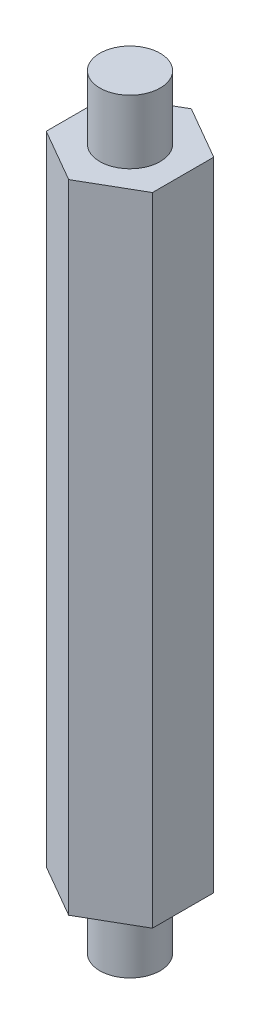
ISO-10303-21;
HEADER;
FILE_DESCRIPTION(('STEP AP214'),'2;1');
FILE_NAME('part.step','',(''),(''),'','','');
FILE_SCHEMA(('AUTOMOTIVE_DESIGN { 1 0 10303 214 1 1 1 1 }'));
ENDSEC;
DATA;
#1=APPLICATION_CONTEXT('core data for automotive mechanical design processes');
#2=APPLICATION_PROTOCOL_DEFINITION('international standard','automotive_design',2000,#1);
#3=PRODUCT_CONTEXT('',#1,'mechanical');
#4=PRODUCT('Part','Part','',(#3));
#5=PRODUCT_RELATED_PRODUCT_CATEGORY('part','',(#4));
#6=PRODUCT_DEFINITION_FORMATION('','',#4);
#7=PRODUCT_DEFINITION_CONTEXT('part definition',#1,'design');
#8=PRODUCT_DEFINITION('design','',#6,#7);
#9=PRODUCT_DEFINITION_SHAPE('','',#8);
#10=(LENGTH_UNIT() NAMED_UNIT(*) SI_UNIT(.MILLI.,.METRE.));
#11=(NAMED_UNIT(*) PLANE_ANGLE_UNIT() SI_UNIT($,.RADIAN.));
#12=(NAMED_UNIT(*) SI_UNIT($,.STERADIAN.) SOLID_ANGLE_UNIT());
#13=UNCERTAINTY_MEASURE_WITH_UNIT(LENGTH_MEASURE(1.E-05),#10,'distance_accuracy_value','');
#14=(GEOMETRIC_REPRESENTATION_CONTEXT(3) GLOBAL_UNCERTAINTY_ASSIGNED_CONTEXT((#13)) GLOBAL_UNIT_ASSIGNED_CONTEXT((#10,
#11,#12)) REPRESENTATION_CONTEXT('',''));
#15=CARTESIAN_POINT('',(0.,0.,0.));
#16=DIRECTION('',(0.,0.,1.));
#17=DIRECTION('',(1.,0.,0.));
#18=AXIS2_PLACEMENT_3D('',#15,#16,#17);
#19=CARTESIAN_POINT('',(2.5,30.,-1.44337567297407));
#20=DIRECTION('',(-0.5,0.,0.866025403784439));
#21=DIRECTION('',(0.866025403784439,0.,0.5));
#22=AXIS2_PLACEMENT_3D('',#19,#20,#21);
#23=PLANE('',#22);
#24=DIRECTION('',(-0.866025403784439,0.,-0.5));
#25=VECTOR('',#24,1.);
#26=CARTESIAN_POINT('',(2.5,0.,-1.44337567297407));
#27=LINE('',#26,#25);
#28=CARTESIAN_POINT('',(2.5,0.,-1.44337567297407));
#29=VERTEX_POINT('',#28);
#30=CARTESIAN_POINT('',(0.,0.,-2.88675134594813));
#31=VERTEX_POINT('',#30);
#32=EDGE_CURVE('E121',#29,#31,#27,.T.);
#33=ORIENTED_EDGE('',*,*,#32,.T.);
#34=DIRECTION('',(0.,-1.,0.));
#35=VECTOR('',#34,1.);
#36=CARTESIAN_POINT('',(0.,30.,-2.88675134594813));
#37=LINE('',#36,#35);
#38=CARTESIAN_POINT('',(0.,30.,-2.88675134594813));
#39=VERTEX_POINT('',#38);
#40=EDGE_CURVE('E44',#39,#31,#37,.T.);
#41=ORIENTED_EDGE('',*,*,#40,.F.);
#42=DIRECTION('',(-0.866025403784439,0.,-0.5));
#43=VECTOR('',#42,1.);
#44=CARTESIAN_POINT('',(2.5,30.,-1.44337567297407));
#45=LINE('',#44,#43);
#46=CARTESIAN_POINT('',(2.5,30.,-1.44337567297407));
#47=VERTEX_POINT('',#46);
#48=EDGE_CURVE('E132',#47,#39,#45,.T.);
#49=ORIENTED_EDGE('',*,*,#48,.F.);
#50=DIRECTION('',(0.,-1.,0.));
#51=VECTOR('',#50,1.);
#52=CARTESIAN_POINT('',(2.5,30.,-1.44337567297407));
#53=LINE('',#52,#51);
#54=EDGE_CURVE('E117',#47,#29,#53,.T.);
#55=ORIENTED_EDGE('',*,*,#54,.T.);
#56=EDGE_LOOP('',(#33,#41,#49,#55));
#57=FACE_BOUND('',#56,.T.);
#58=ADVANCED_FACE('F36',(#57),#23,.F.);
#59=CARTESIAN_POINT('',(0.,30.,-2.88675134594813));
#60=DIRECTION('',(0.5,0.,0.866025403784439));
#61=DIRECTION('',(0.866025403784439,0.,-0.5));
#62=AXIS2_PLACEMENT_3D('',#59,#60,#61);
#63=PLANE('',#62);
#64=DIRECTION('',(-0.866025403784439,0.,0.5));
#65=VECTOR('',#64,1.);
#66=CARTESIAN_POINT('',(0.,0.,-2.88675134594813));
#67=LINE('',#66,#65);
#68=CARTESIAN_POINT('',(-2.5,0.,-1.44337567297407));
#69=VERTEX_POINT('',#68);
#70=EDGE_CURVE('E124',#31,#69,#67,.T.);
#71=ORIENTED_EDGE('',*,*,#70,.T.);
#72=DIRECTION('',(0.,-1.,0.));
#73=VECTOR('',#72,1.);
#74=CARTESIAN_POINT('',(-2.5,30.,-1.44337567297407));
#75=LINE('',#74,#73);
#76=CARTESIAN_POINT('',(-2.5,30.,-1.44337567297407));
#77=VERTEX_POINT('',#76);
#78=EDGE_CURVE('E136',#77,#69,#75,.T.);
#79=ORIENTED_EDGE('',*,*,#78,.F.);
#80=DIRECTION('',(-0.866025403784439,0.,0.5));
#81=VECTOR('',#80,1.);
#82=CARTESIAN_POINT('',(0.,30.,-2.88675134594813));
#83=LINE('',#82,#81);
#84=EDGE_CURVE('E90',#39,#77,#83,.T.);
#85=ORIENTED_EDGE('',*,*,#84,.F.);
#86=ORIENTED_EDGE('',*,*,#40,.T.);
#87=EDGE_LOOP('',(#71,#79,#85,#86));
#88=FACE_BOUND('',#87,.T.);
#89=ADVANCED_FACE('F139',(#88),#63,.F.);
#90=CARTESIAN_POINT('',(-2.5,30.,-1.44337567297407));
#91=DIRECTION('',(1.,0.,0.));
#92=DIRECTION('',(0.,0.,-1.));
#93=AXIS2_PLACEMENT_3D('',#90,#91,#92);
#94=PLANE('',#93);
#95=DIRECTION('',(0.,0.,1.));
#96=VECTOR('',#95,1.);
#97=CARTESIAN_POINT('',(-2.5,0.,-1.44337567297407));
#98=LINE('',#97,#96);
#99=CARTESIAN_POINT('',(-2.5,0.,1.44337567297406));
#100=VERTEX_POINT('',#99);
#101=EDGE_CURVE('E127',#69,#100,#98,.T.);
#102=ORIENTED_EDGE('',*,*,#101,.T.);
#103=DIRECTION('',(0.,-1.,0.));
#104=VECTOR('',#103,1.);
#105=CARTESIAN_POINT('',(-2.5,30.,1.44337567297406));
#106=LINE('',#105,#104);
#107=CARTESIAN_POINT('',(-2.5,30.,1.44337567297406));
#108=VERTEX_POINT('',#107);
#109=EDGE_CURVE('E112',#108,#100,#106,.T.);
#110=ORIENTED_EDGE('',*,*,#109,.F.);
#111=DIRECTION('',(0.,0.,1.));
#112=VECTOR('',#111,1.);
#113=CARTESIAN_POINT('',(-2.5,30.,-1.44337567297407));
#114=LINE('',#113,#112);
#115=EDGE_CURVE('E103',#77,#108,#114,.T.);
#116=ORIENTED_EDGE('',*,*,#115,.F.);
#117=ORIENTED_EDGE('',*,*,#78,.T.);
#118=EDGE_LOOP('',(#102,#110,#116,#117));
#119=FACE_BOUND('',#118,.T.);
#120=ADVANCED_FACE('F147',(#119),#94,.F.);
#121=CARTESIAN_POINT('',(-2.5,30.,1.44337567297406));
#122=DIRECTION('',(0.5,0.,-0.866025403784438));
#123=DIRECTION('',(-0.866025403784439,0.,-0.5));
#124=AXIS2_PLACEMENT_3D('',#121,#122,#123);
#125=PLANE('',#124);
#126=DIRECTION('',(0.866025403784439,0.,0.5));
#127=VECTOR('',#126,1.);
#128=CARTESIAN_POINT('',(-2.5,0.,1.44337567297406));
#129=LINE('',#128,#127);
#130=CARTESIAN_POINT('',(0.,0.,2.88675134594813));
#131=VERTEX_POINT('',#130);
#132=EDGE_CURVE('E111',#100,#131,#129,.T.);
#133=ORIENTED_EDGE('',*,*,#132,.T.);
#134=DIRECTION('',(0.,-1.,0.));
#135=VECTOR('',#134,1.);
#136=CARTESIAN_POINT('',(0.,30.,2.88675134594813));
#137=LINE('',#136,#135);
#138=CARTESIAN_POINT('',(0.,30.,2.88675134594813));
#139=VERTEX_POINT('',#138);
#140=EDGE_CURVE('E108',#139,#131,#137,.T.);
#141=ORIENTED_EDGE('',*,*,#140,.F.);
#142=DIRECTION('',(0.866025403784439,0.,0.5));
#143=VECTOR('',#142,1.);
#144=CARTESIAN_POINT('',(-2.5,30.,1.44337567297406));
#145=LINE('',#144,#143);
#146=EDGE_CURVE('E97',#108,#139,#145,.T.);
#147=ORIENTED_EDGE('',*,*,#146,.F.);
#148=ORIENTED_EDGE('',*,*,#109,.T.);
#149=EDGE_LOOP('',(#133,#141,#147,#148));
#150=FACE_BOUND('',#149,.T.);
#151=ADVANCED_FACE('F109',(#150),#125,.F.);
#152=CARTESIAN_POINT('',(0.,30.,2.88675134594813));
#153=DIRECTION('',(-0.5,0.,-0.866025403784439));
#154=DIRECTION('',(-0.866025403784439,0.,0.5));
#155=AXIS2_PLACEMENT_3D('',#152,#153,#154);
#156=PLANE('',#155);
#157=DIRECTION('',(0.866025403784439,0.,-0.5));
#158=VECTOR('',#157,1.);
#159=CARTESIAN_POINT('',(0.,0.,2.88675134594813));
#160=LINE('',#159,#158);
#161=CARTESIAN_POINT('',(2.5,0.,1.44337567297407));
#162=VERTEX_POINT('',#161);
#163=EDGE_CURVE('E75',#131,#162,#160,.T.);
#164=ORIENTED_EDGE('',*,*,#163,.T.);
#165=DIRECTION('',(0.,-1.,0.));
#166=VECTOR('',#165,1.);
#167=CARTESIAN_POINT('',(2.5,30.,1.44337567297407));
#168=LINE('',#167,#166);
#169=CARTESIAN_POINT('',(2.5,30.,1.44337567297407));
#170=VERTEX_POINT('',#169);
#171=EDGE_CURVE('E113',#170,#162,#168,.T.);
#172=ORIENTED_EDGE('',*,*,#171,.F.);
#173=DIRECTION('',(0.866025403784439,0.,-0.5));
#174=VECTOR('',#173,1.);
#175=CARTESIAN_POINT('',(0.,30.,2.88675134594813));
#176=LINE('',#175,#174);
#177=EDGE_CURVE('E101',#139,#170,#176,.T.);
#178=ORIENTED_EDGE('',*,*,#177,.F.);
#179=ORIENTED_EDGE('',*,*,#140,.T.);
#180=EDGE_LOOP('',(#164,#172,#178,#179));
#181=FACE_BOUND('',#180,.T.);
#182=ADVANCED_FACE('F115',(#181),#156,.F.);
#183=CARTESIAN_POINT('',(2.5,30.,1.44337567297407));
#184=DIRECTION('',(-1.,0.,0.));
#185=DIRECTION('',(0.,0.,1.));
#186=AXIS2_PLACEMENT_3D('',#183,#184,#185);
#187=PLANE('',#186);
#188=DIRECTION('',(0.,0.,-1.));
#189=VECTOR('',#188,1.);
#190=CARTESIAN_POINT('',(2.5,0.,1.44337567297407));
#191=LINE('',#190,#189);
#192=EDGE_CURVE('E81',#162,#29,#191,.T.);
#193=ORIENTED_EDGE('',*,*,#192,.T.);
#194=ORIENTED_EDGE('',*,*,#54,.F.);
#195=DIRECTION('',(0.,0.,-1.));
#196=VECTOR('',#195,1.);
#197=CARTESIAN_POINT('',(2.5,30.,1.44337567297407));
#198=LINE('',#197,#196);
#199=EDGE_CURVE('E52',#170,#47,#198,.T.);
#200=ORIENTED_EDGE('',*,*,#199,.F.);
#201=ORIENTED_EDGE('',*,*,#171,.T.);
#202=EDGE_LOOP('',(#193,#194,#200,#201));
#203=FACE_BOUND('',#202,.T.);
#204=ADVANCED_FACE('F178',(#203),#187,.F.);
#205=CARTESIAN_POINT('',(0.,30.,0.));
#206=DIRECTION('',(0.,1.,0.));
#207=DIRECTION('',(0.,0.,1.));
#208=AXIS2_PLACEMENT_3D('',#205,#206,#207);
#209=PLANE('',#208);
#210=CARTESIAN_POINT('',(0.,30.,0.));
#211=DIRECTION('',(0.,1.,0.));
#212=DIRECTION('',(0.,0.,1.));
#213=AXIS2_PLACEMENT_3D('',#210,#211,#212);
#214=CIRCLE('',#213,1.42);
#215=CARTESIAN_POINT('',(0.,30.,1.42));
#216=VERTEX_POINT('',#215);
#217=EDGE_CURVE('E151',#216,#216,#214,.T.);
#218=ORIENTED_EDGE('',*,*,#217,.F.);
#219=EDGE_LOOP('',(#218));
#220=FACE_BOUND('',#219,.T.);
#221=ORIENTED_EDGE('',*,*,#48,.T.);
#222=ORIENTED_EDGE('',*,*,#84,.T.);
#223=ORIENTED_EDGE('',*,*,#115,.T.);
#224=ORIENTED_EDGE('',*,*,#146,.T.);
#225=ORIENTED_EDGE('',*,*,#177,.T.);
#226=ORIENTED_EDGE('',*,*,#199,.T.);
#227=EDGE_LOOP('',(#221,#222,#223,#224,#225,#226));
#228=FACE_BOUND('',#227,.T.);
#229=ADVANCED_FACE('F99',(#220,#228),#209,.T.);
#230=CARTESIAN_POINT('',(0.,0.,0.));
#231=DIRECTION('',(0.,1.,0.));
#232=DIRECTION('',(0.,0.,1.));
#233=AXIS2_PLACEMENT_3D('',#230,#231,#232);
#234=PLANE('',#233);
#235=CARTESIAN_POINT('',(0.,0.,0.));
#236=DIRECTION('',(0.,1.,0.));
#237=DIRECTION('',(0.,0.,1.));
#238=AXIS2_PLACEMENT_3D('',#235,#236,#237);
#239=CIRCLE('',#238,1.42);
#240=CARTESIAN_POINT('',(0.,0.,1.42));
#241=VERTEX_POINT('',#240);
#242=EDGE_CURVE('E11',#241,#241,#239,.F.);
#243=ORIENTED_EDGE('',*,*,#242,.F.);
#244=EDGE_LOOP('',(#243));
#245=FACE_BOUND('',#244,.T.);
#246=ORIENTED_EDGE('',*,*,#32,.F.);
#247=ORIENTED_EDGE('',*,*,#192,.F.);
#248=ORIENTED_EDGE('',*,*,#163,.F.);
#249=ORIENTED_EDGE('',*,*,#132,.F.);
#250=ORIENTED_EDGE('',*,*,#101,.F.);
#251=ORIENTED_EDGE('',*,*,#70,.F.);
#252=EDGE_LOOP('',(#246,#247,#248,#249,#250,#251));
#253=FACE_BOUND('',#252,.T.);
#254=ADVANCED_FACE('F144',(#245,#253),#234,.F.);
#255=CARTESIAN_POINT('',(0.,33.,0.));
#256=DIRECTION('',(0.,-1.,0.));
#257=DIRECTION('',(0.,0.,-1.));
#258=AXIS2_PLACEMENT_3D('',#255,#256,#257);
#259=CYLINDRICAL_SURFACE('',#258,1.42);
#260=CARTESIAN_POINT('',(0.,33.,0.));
#261=DIRECTION('',(0.,1.,0.));
#262=DIRECTION('',(0.,0.,1.));
#263=AXIS2_PLACEMENT_3D('',#260,#261,#262);
#264=CIRCLE('',#263,1.42);
#265=CARTESIAN_POINT('',(0.,33.,1.42));
#266=VERTEX_POINT('',#265);
#267=EDGE_CURVE('E125',#266,#266,#264,.T.);
#268=ORIENTED_EDGE('',*,*,#267,.F.);
#269=EDGE_LOOP('',(#268));
#270=FACE_BOUND('',#269,.T.);
#271=ORIENTED_EDGE('',*,*,#217,.T.);
#272=EDGE_LOOP('',(#271));
#273=FACE_BOUND('',#272,.T.);
#274=ADVANCED_FACE('F170',(#270,#273),#259,.T.);
#275=CARTESIAN_POINT('',(0.,33.,0.));
#276=DIRECTION('',(0.,1.,0.));
#277=DIRECTION('',(0.,0.,1.));
#278=AXIS2_PLACEMENT_3D('',#275,#276,#277);
#279=PLANE('',#278);
#280=ORIENTED_EDGE('',*,*,#267,.T.);
#281=EDGE_LOOP('',(#280));
#282=FACE_BOUND('',#281,.T.);
#283=ADVANCED_FACE('F165',(#282),#279,.T.);
#284=CARTESIAN_POINT('',(0.,-3.,0.));
#285=DIRECTION('',(0.,1.,0.));
#286=DIRECTION('',(0.,0.,1.));
#287=AXIS2_PLACEMENT_3D('',#284,#285,#286);
#288=CYLINDRICAL_SURFACE('',#287,1.42);
#289=CARTESIAN_POINT('',(0.,-3.,0.));
#290=DIRECTION('',(0.,-1.,0.));
#291=DIRECTION('',(0.,0.,-1.));
#292=AXIS2_PLACEMENT_3D('',#289,#290,#291);
#293=CIRCLE('',#292,1.42);
#294=CARTESIAN_POINT('',(0.,-3.,-1.42));
#295=VERTEX_POINT('',#294);
#296=EDGE_CURVE('E154',#295,#295,#293,.T.);
#297=ORIENTED_EDGE('',*,*,#296,.F.);
#298=EDGE_LOOP('',(#297));
#299=FACE_BOUND('',#298,.T.);
#300=ORIENTED_EDGE('',*,*,#242,.T.);
#301=EDGE_LOOP('',(#300));
#302=FACE_BOUND('',#301,.T.);
#303=ADVANCED_FACE('F162',(#299,#302),#288,.T.);
#304=CARTESIAN_POINT('',(0.,-3.,0.));
#305=DIRECTION('',(0.,-1.,0.));
#306=DIRECTION('',(0.,0.,-1.));
#307=AXIS2_PLACEMENT_3D('',#304,#305,#306);
#308=PLANE('',#307);
#309=ORIENTED_EDGE('',*,*,#296,.T.);
#310=EDGE_LOOP('',(#309));
#311=FACE_BOUND('',#310,.T.);
#312=ADVANCED_FACE('F160',(#311),#308,.T.);
#313=CLOSED_SHELL('',(#58,#89,#120,#151,#182,#204,#229,#254,#274,#283,#303,#312));
#314=MANIFOLD_SOLID_BREP('B2',#313);
#315=ADVANCED_BREP_SHAPE_REPRESENTATION('',(#18,#314),#14);
#316=SHAPE_DEFINITION_REPRESENTATION(#9,#315);
ENDSEC;
END-ISO-10303-21;
